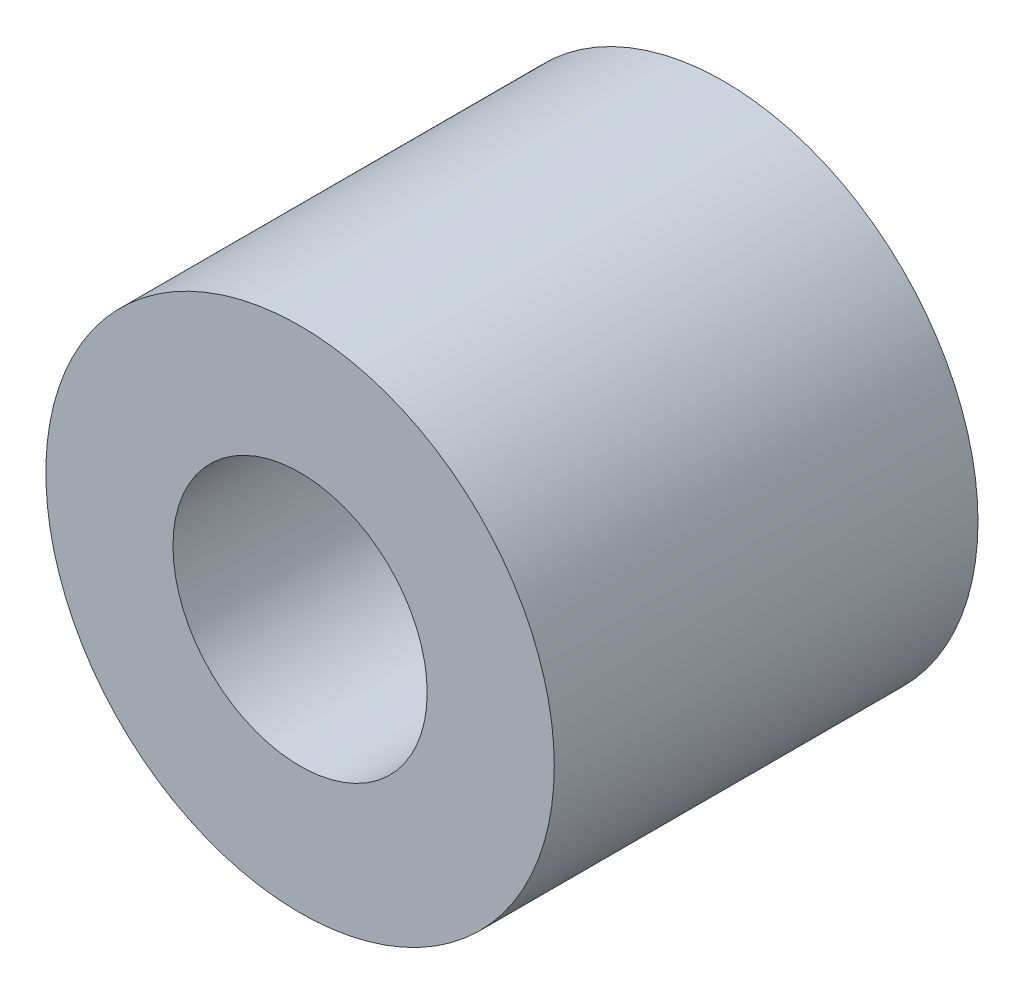
ISO-10303-21;
HEADER;
FILE_DESCRIPTION(('STEP AP214'),'2;1');
FILE_NAME('part.step','',(''),(''),'','','');
FILE_SCHEMA(('AUTOMOTIVE_DESIGN { 1 0 10303 214 1 1 1 1 }'));
ENDSEC;
DATA;
#1=APPLICATION_CONTEXT('core data for automotive mechanical design processes');
#2=APPLICATION_PROTOCOL_DEFINITION('international standard','automotive_design',2000,#1);
#3=PRODUCT_CONTEXT('',#1,'mechanical');
#4=PRODUCT('Part','Part','',(#3));
#5=PRODUCT_RELATED_PRODUCT_CATEGORY('part','',(#4));
#6=PRODUCT_DEFINITION_FORMATION('','',#4);
#7=PRODUCT_DEFINITION_CONTEXT('part definition',#1,'design');
#8=PRODUCT_DEFINITION('design','',#6,#7);
#9=PRODUCT_DEFINITION_SHAPE('','',#8);
#10=(LENGTH_UNIT() NAMED_UNIT(*) SI_UNIT(.MILLI.,.METRE.));
#11=(NAMED_UNIT(*) PLANE_ANGLE_UNIT() SI_UNIT($,.RADIAN.));
#12=(NAMED_UNIT(*) SI_UNIT($,.STERADIAN.) SOLID_ANGLE_UNIT());
#13=UNCERTAINTY_MEASURE_WITH_UNIT(LENGTH_MEASURE(1.E-05),#10,'distance_accuracy_value','');
#14=(GEOMETRIC_REPRESENTATION_CONTEXT(3) GLOBAL_UNCERTAINTY_ASSIGNED_CONTEXT((#13)) GLOBAL_UNIT_ASSIGNED_CONTEXT((#10,
#11,#12)) REPRESENTATION_CONTEXT('',''));
#15=CARTESIAN_POINT('',(0.,0.,0.));
#16=DIRECTION('',(0.,0.,1.));
#17=DIRECTION('',(1.,0.,0.));
#18=AXIS2_PLACEMENT_3D('',#15,#16,#17);
#19=CARTESIAN_POINT('',(0.,0.,5.));
#20=DIRECTION('',(0.,0.,1.));
#21=DIRECTION('',(1.,0.,0.));
#22=AXIS2_PLACEMENT_3D('',#19,#20,#21);
#23=PLANE('',#22);
#24=CARTESIAN_POINT('',(0.,0.,5.));
#25=DIRECTION('',(0.,0.,1.));
#26=DIRECTION('',(1.,0.,0.));
#27=AXIS2_PLACEMENT_3D('',#24,#25,#26);
#28=CIRCLE('',#27,6.);
#29=CARTESIAN_POINT('',(6.,0.,5.));
#30=VERTEX_POINT('',#29);
#31=EDGE_CURVE('E10',#30,#30,#28,.T.);
#32=ORIENTED_EDGE('',*,*,#31,.T.);
#33=EDGE_LOOP('',(#32));
#34=FACE_BOUND('',#33,.T.);
#35=CARTESIAN_POINT('',(0.,0.,5.));
#36=DIRECTION('',(0.,0.,1.));
#37=DIRECTION('',(1.,0.,0.));
#38=AXIS2_PLACEMENT_3D('',#35,#36,#37);
#39=CIRCLE('',#38,3.);
#40=CARTESIAN_POINT('',(3.,0.,5.));
#41=VERTEX_POINT('',#40);
#42=EDGE_CURVE('E44',#41,#41,#39,.T.);
#43=ORIENTED_EDGE('',*,*,#42,.F.);
#44=EDGE_LOOP('',(#43));
#45=FACE_BOUND('',#44,.T.);
#46=ADVANCED_FACE('F33',(#34,#45),#23,.T.);
#47=CARTESIAN_POINT('',(0.,0.,-5.));
#48=DIRECTION('',(0.,0.,1.));
#49=DIRECTION('',(1.,0.,0.));
#50=AXIS2_PLACEMENT_3D('',#47,#48,#49);
#51=PLANE('',#50);
#52=CARTESIAN_POINT('',(0.,0.,-5.));
#53=DIRECTION('',(0.,0.,1.));
#54=DIRECTION('',(1.,0.,0.));
#55=AXIS2_PLACEMENT_3D('',#52,#53,#54);
#56=CIRCLE('',#55,6.);
#57=CARTESIAN_POINT('',(6.,0.,-5.));
#58=VERTEX_POINT('',#57);
#59=EDGE_CURVE('E37',#58,#58,#56,.T.);
#60=ORIENTED_EDGE('',*,*,#59,.F.);
#61=EDGE_LOOP('',(#60));
#62=FACE_BOUND('',#61,.T.);
#63=CARTESIAN_POINT('',(0.,0.,-5.));
#64=DIRECTION('',(0.,0.,1.));
#65=DIRECTION('',(1.,0.,0.));
#66=AXIS2_PLACEMENT_3D('',#63,#64,#65);
#67=CIRCLE('',#66,3.);
#68=CARTESIAN_POINT('',(3.,0.,-5.));
#69=VERTEX_POINT('',#68);
#70=EDGE_CURVE('E46',#69,#69,#67,.T.);
#71=ORIENTED_EDGE('',*,*,#70,.T.);
#72=EDGE_LOOP('',(#71));
#73=FACE_BOUND('',#72,.T.);
#74=ADVANCED_FACE('F56',(#62,#73),#51,.F.);
#75=CARTESIAN_POINT('',(0.,0.,5.));
#76=DIRECTION('',(0.,0.,-1.));
#77=DIRECTION('',(-1.,0.,0.));
#78=AXIS2_PLACEMENT_3D('',#75,#76,#77);
#79=CYLINDRICAL_SURFACE('',#78,6.);
#80=ORIENTED_EDGE('',*,*,#31,.F.);
#81=EDGE_LOOP('',(#80));
#82=FACE_BOUND('',#81,.T.);
#83=ORIENTED_EDGE('',*,*,#59,.T.);
#84=EDGE_LOOP('',(#83));
#85=FACE_BOUND('',#84,.T.);
#86=ADVANCED_FACE('F35',(#82,#85),#79,.T.);
#87=CARTESIAN_POINT('',(0.,0.,5.));
#88=DIRECTION('',(0.,0.,-1.));
#89=DIRECTION('',(-1.,0.,0.));
#90=AXIS2_PLACEMENT_3D('',#87,#88,#89);
#91=CYLINDRICAL_SURFACE('',#90,3.);
#92=ORIENTED_EDGE('',*,*,#42,.T.);
#93=EDGE_LOOP('',(#92));
#94=FACE_BOUND('',#93,.T.);
#95=ORIENTED_EDGE('',*,*,#70,.F.);
#96=EDGE_LOOP('',(#95));
#97=FACE_BOUND('',#96,.T.);
#98=ADVANCED_FACE('F52',(#94,#97),#91,.F.);
#99=CLOSED_SHELL('',(#46,#74,#86,#98));
#100=MANIFOLD_SOLID_BREP('B2',#99);
#101=ADVANCED_BREP_SHAPE_REPRESENTATION('',(#18,#100),#14);
#102=SHAPE_DEFINITION_REPRESENTATION(#9,#101);
ENDSEC;
END-ISO-10303-21;
